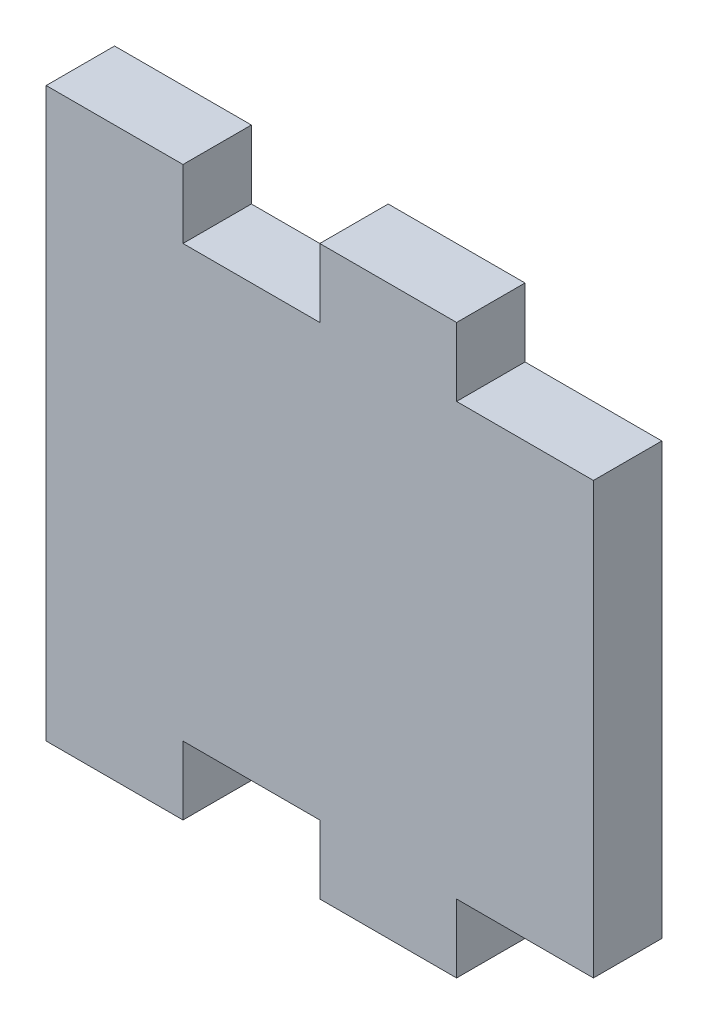
ISO-10303-21;
HEADER;
FILE_DESCRIPTION(('STEP AP214'),'2;1');
FILE_NAME('part.step','',(''),(''),'','','');
FILE_SCHEMA(('AUTOMOTIVE_DESIGN { 1 0 10303 214 1 1 1 1 }'));
ENDSEC;
DATA;
#1=APPLICATION_CONTEXT('core data for automotive mechanical design processes');
#2=APPLICATION_PROTOCOL_DEFINITION('international standard','automotive_design',2000,#1);
#3=PRODUCT_CONTEXT('',#1,'mechanical');
#4=PRODUCT('Part','Part','',(#3));
#5=PRODUCT_RELATED_PRODUCT_CATEGORY('part','',(#4));
#6=PRODUCT_DEFINITION_FORMATION('','',#4);
#7=PRODUCT_DEFINITION_CONTEXT('part definition',#1,'design');
#8=PRODUCT_DEFINITION('design','',#6,#7);
#9=PRODUCT_DEFINITION_SHAPE('','',#8);
#10=(LENGTH_UNIT() NAMED_UNIT(*) SI_UNIT(.MILLI.,.METRE.));
#11=(NAMED_UNIT(*) PLANE_ANGLE_UNIT() SI_UNIT($,.RADIAN.));
#12=(NAMED_UNIT(*) SI_UNIT($,.STERADIAN.) SOLID_ANGLE_UNIT());
#13=UNCERTAINTY_MEASURE_WITH_UNIT(LENGTH_MEASURE(1.E-05),#10,'distance_accuracy_value','');
#14=(GEOMETRIC_REPRESENTATION_CONTEXT(3) GLOBAL_UNCERTAINTY_ASSIGNED_CONTEXT((#13)) GLOBAL_UNIT_ASSIGNED_CONTEXT((#10,
#11,#12)) REPRESENTATION_CONTEXT('',''));
#15=CARTESIAN_POINT('',(0.,0.,0.));
#16=DIRECTION('',(0.,0.,1.));
#17=DIRECTION('',(1.,0.,0.));
#18=AXIS2_PLACEMENT_3D('',#15,#16,#17);
#19=CARTESIAN_POINT('',(0.,-3.175,3.175));
#20=DIRECTION('',(0.,1.,0.));
#21=DIRECTION('',(0.,0.,1.));
#22=AXIS2_PLACEMENT_3D('',#19,#20,#21);
#23=PLANE('',#22);
#24=DIRECTION('',(1.,0.,0.));
#25=VECTOR('',#24,1.);
#26=CARTESIAN_POINT('',(0.,-3.175,0.));
#27=LINE('',#26,#25);
#28=CARTESIAN_POINT('',(0.,-3.175,0.));
#29=VERTEX_POINT('',#28);
#30=CARTESIAN_POINT('',(6.35,-3.175,0.));
#31=VERTEX_POINT('',#30);
#32=EDGE_CURVE('E177',#29,#31,#27,.T.);
#33=ORIENTED_EDGE('',*,*,#32,.T.);
#34=DIRECTION('',(0.,0.,-1.));
#35=VECTOR('',#34,1.);
#36=CARTESIAN_POINT('',(6.35,-3.175,3.175));
#37=LINE('',#36,#35);
#38=CARTESIAN_POINT('',(6.35,-3.175,3.175));
#39=VERTEX_POINT('',#38);
#40=EDGE_CURVE('E41',#39,#31,#37,.T.);
#41=ORIENTED_EDGE('',*,*,#40,.F.);
#42=DIRECTION('',(1.,0.,0.));
#43=VECTOR('',#42,1.);
#44=CARTESIAN_POINT('',(0.,-3.175,3.175));
#45=LINE('',#44,#43);
#46=CARTESIAN_POINT('',(0.,-3.175,3.175));
#47=VERTEX_POINT('',#46);
#48=EDGE_CURVE('E294',#47,#39,#45,.T.);
#49=ORIENTED_EDGE('',*,*,#48,.F.);
#50=DIRECTION('',(0.,0.,-1.));
#51=VECTOR('',#50,1.);
#52=CARTESIAN_POINT('',(0.,-3.175,3.175));
#53=LINE('',#52,#51);
#54=EDGE_CURVE('E11',#47,#29,#53,.T.);
#55=ORIENTED_EDGE('',*,*,#54,.T.);
#56=EDGE_LOOP('',(#33,#41,#49,#55));
#57=FACE_BOUND('',#56,.T.);
#58=ADVANCED_FACE('F33',(#57),#23,.F.);
#59=CARTESIAN_POINT('',(6.35,-3.175,3.175));
#60=DIRECTION('',(-1.,0.,0.));
#61=DIRECTION('',(0.,0.,1.));
#62=AXIS2_PLACEMENT_3D('',#59,#60,#61);
#63=PLANE('',#62);
#64=DIRECTION('',(0.,1.,0.));
#65=VECTOR('',#64,1.);
#66=CARTESIAN_POINT('',(6.35,-3.175,0.));
#67=LINE('',#66,#65);
#68=CARTESIAN_POINT('',(6.35,0.,0.));
#69=VERTEX_POINT('',#68);
#70=EDGE_CURVE('E179',#31,#69,#67,.T.);
#71=ORIENTED_EDGE('',*,*,#70,.T.);
#72=DIRECTION('',(0.,0.,-1.));
#73=VECTOR('',#72,1.);
#74=CARTESIAN_POINT('',(6.35,0.,3.175));
#75=LINE('',#74,#73);
#76=CARTESIAN_POINT('',(6.35,0.,3.175));
#77=VERTEX_POINT('',#76);
#78=EDGE_CURVE('E236',#77,#69,#75,.T.);
#79=ORIENTED_EDGE('',*,*,#78,.F.);
#80=DIRECTION('',(0.,1.,0.));
#81=VECTOR('',#80,1.);
#82=CARTESIAN_POINT('',(6.35,-3.175,3.175));
#83=LINE('',#82,#81);
#84=EDGE_CURVE('E245',#39,#77,#83,.T.);
#85=ORIENTED_EDGE('',*,*,#84,.F.);
#86=ORIENTED_EDGE('',*,*,#40,.T.);
#87=EDGE_LOOP('',(#71,#79,#85,#86));
#88=FACE_BOUND('',#87,.T.);
#89=ADVANCED_FACE('F243',(#88),#63,.F.);
#90=CARTESIAN_POINT('',(6.35,0.,3.175));
#91=DIRECTION('',(0.,1.,0.));
#92=DIRECTION('',(0.,0.,1.));
#93=AXIS2_PLACEMENT_3D('',#90,#91,#92);
#94=PLANE('',#93);
#95=DIRECTION('',(1.,0.,0.));
#96=VECTOR('',#95,1.);
#97=CARTESIAN_POINT('',(6.35,0.,0.));
#98=LINE('',#97,#96);
#99=CARTESIAN_POINT('',(12.7,0.,0.));
#100=VERTEX_POINT('',#99);
#101=EDGE_CURVE('E181',#69,#100,#98,.T.);
#102=ORIENTED_EDGE('',*,*,#101,.T.);
#103=DIRECTION('',(0.,0.,-1.));
#104=VECTOR('',#103,1.);
#105=CARTESIAN_POINT('',(12.7,0.,3.175));
#106=LINE('',#105,#104);
#107=CARTESIAN_POINT('',(12.7,0.,3.175));
#108=VERTEX_POINT('',#107);
#109=EDGE_CURVE('E233',#108,#100,#106,.T.);
#110=ORIENTED_EDGE('',*,*,#109,.F.);
#111=DIRECTION('',(1.,0.,0.));
#112=VECTOR('',#111,1.);
#113=CARTESIAN_POINT('',(6.35,0.,3.175));
#114=LINE('',#113,#112);
#115=EDGE_CURVE('E266',#77,#108,#114,.T.);
#116=ORIENTED_EDGE('',*,*,#115,.F.);
#117=ORIENTED_EDGE('',*,*,#78,.T.);
#118=EDGE_LOOP('',(#102,#110,#116,#117));
#119=FACE_BOUND('',#118,.T.);
#120=ADVANCED_FACE('F257',(#119),#94,.F.);
#121=CARTESIAN_POINT('',(12.7,0.,3.175));
#122=DIRECTION('',(1.,0.,0.));
#123=DIRECTION('',(0.,0.,-1.));
#124=AXIS2_PLACEMENT_3D('',#121,#122,#123);
#125=PLANE('',#124);
#126=DIRECTION('',(0.,-1.,0.));
#127=VECTOR('',#126,1.);
#128=CARTESIAN_POINT('',(12.7,0.,0.));
#129=LINE('',#128,#127);
#130=CARTESIAN_POINT('',(12.7,-3.175,0.));
#131=VERTEX_POINT('',#130);
#132=EDGE_CURVE('E183',#100,#131,#129,.T.);
#133=ORIENTED_EDGE('',*,*,#132,.T.);
#134=DIRECTION('',(0.,0.,-1.));
#135=VECTOR('',#134,1.);
#136=CARTESIAN_POINT('',(12.7,-3.175,3.175));
#137=LINE('',#136,#135);
#138=CARTESIAN_POINT('',(12.7,-3.175,3.175));
#139=VERTEX_POINT('',#138);
#140=EDGE_CURVE('E230',#139,#131,#137,.T.);
#141=ORIENTED_EDGE('',*,*,#140,.F.);
#142=DIRECTION('',(0.,-1.,0.));
#143=VECTOR('',#142,1.);
#144=CARTESIAN_POINT('',(12.7,0.,3.175));
#145=LINE('',#144,#143);
#146=EDGE_CURVE('E263',#108,#139,#145,.T.);
#147=ORIENTED_EDGE('',*,*,#146,.F.);
#148=ORIENTED_EDGE('',*,*,#109,.T.);
#149=EDGE_LOOP('',(#133,#141,#147,#148));
#150=FACE_BOUND('',#149,.T.);
#151=ADVANCED_FACE('F261',(#150),#125,.F.);
#152=CARTESIAN_POINT('',(12.7,-3.175,3.175));
#153=DIRECTION('',(0.,1.,0.));
#154=DIRECTION('',(-1.,0.,0.));
#155=AXIS2_PLACEMENT_3D('',#152,#153,#154);
#156=PLANE('',#155);
#157=DIRECTION('',(1.,0.,0.));
#158=VECTOR('',#157,1.);
#159=CARTESIAN_POINT('',(12.7,-3.175,0.));
#160=LINE('',#159,#158);
#161=CARTESIAN_POINT('',(19.05,-3.175,0.));
#162=VERTEX_POINT('',#161);
#163=EDGE_CURVE('E185',#131,#162,#160,.T.);
#164=ORIENTED_EDGE('',*,*,#163,.T.);
#165=DIRECTION('',(0.,0.,-1.));
#166=VECTOR('',#165,1.);
#167=CARTESIAN_POINT('',(19.05,-3.175,3.175));
#168=LINE('',#167,#166);
#169=CARTESIAN_POINT('',(19.05,-3.175,3.175));
#170=VERTEX_POINT('',#169);
#171=EDGE_CURVE('E227',#170,#162,#168,.T.);
#172=ORIENTED_EDGE('',*,*,#171,.F.);
#173=DIRECTION('',(1.,0.,0.));
#174=VECTOR('',#173,1.);
#175=CARTESIAN_POINT('',(12.7,-3.175,3.175));
#176=LINE('',#175,#174);
#177=EDGE_CURVE('E265',#139,#170,#176,.T.);
#178=ORIENTED_EDGE('',*,*,#177,.F.);
#179=ORIENTED_EDGE('',*,*,#140,.T.);
#180=EDGE_LOOP('',(#164,#172,#178,#179));
#181=FACE_BOUND('',#180,.T.);
#182=ADVANCED_FACE('F308',(#181),#156,.F.);
#183=CARTESIAN_POINT('',(19.05,-3.175,3.175));
#184=DIRECTION('',(-1.,0.,0.));
#185=DIRECTION('',(0.,0.,1.));
#186=AXIS2_PLACEMENT_3D('',#183,#184,#185);
#187=PLANE('',#186);
#188=DIRECTION('',(0.,1.,0.));
#189=VECTOR('',#188,1.);
#190=CARTESIAN_POINT('',(19.05,-3.175,0.));
#191=LINE('',#190,#189);
#192=CARTESIAN_POINT('',(19.05,0.,0.));
#193=VERTEX_POINT('',#192);
#194=EDGE_CURVE('E187',#162,#193,#191,.T.);
#195=ORIENTED_EDGE('',*,*,#194,.T.);
#196=DIRECTION('',(0.,0.,-1.));
#197=VECTOR('',#196,1.);
#198=CARTESIAN_POINT('',(19.05,0.,3.175));
#199=LINE('',#198,#197);
#200=CARTESIAN_POINT('',(19.05,0.,3.175));
#201=VERTEX_POINT('',#200);
#202=EDGE_CURVE('E224',#201,#193,#199,.T.);
#203=ORIENTED_EDGE('',*,*,#202,.F.);
#204=DIRECTION('',(0.,1.,0.));
#205=VECTOR('',#204,1.);
#206=CARTESIAN_POINT('',(19.05,-3.175,3.175));
#207=LINE('',#206,#205);
#208=EDGE_CURVE('E268',#170,#201,#207,.T.);
#209=ORIENTED_EDGE('',*,*,#208,.F.);
#210=ORIENTED_EDGE('',*,*,#171,.T.);
#211=EDGE_LOOP('',(#195,#203,#209,#210));
#212=FACE_BOUND('',#211,.T.);
#213=ADVANCED_FACE('F311',(#212),#187,.F.);
#214=CARTESIAN_POINT('',(19.05,0.,3.175));
#215=DIRECTION('',(0.,1.,0.));
#216=DIRECTION('',(0.,0.,1.));
#217=AXIS2_PLACEMENT_3D('',#214,#215,#216);
#218=PLANE('',#217);
#219=DIRECTION('',(1.,0.,0.));
#220=VECTOR('',#219,1.);
#221=CARTESIAN_POINT('',(19.05,0.,0.));
#222=LINE('',#221,#220);
#223=CARTESIAN_POINT('',(25.4,0.,0.));
#224=VERTEX_POINT('',#223);
#225=EDGE_CURVE('E189',#193,#224,#222,.T.);
#226=ORIENTED_EDGE('',*,*,#225,.T.);
#227=DIRECTION('',(0.,0.,-1.));
#228=VECTOR('',#227,1.);
#229=CARTESIAN_POINT('',(25.4,0.,3.175));
#230=LINE('',#229,#228);
#231=CARTESIAN_POINT('',(25.4,0.,3.175));
#232=VERTEX_POINT('',#231);
#233=EDGE_CURVE('E221',#232,#224,#230,.T.);
#234=ORIENTED_EDGE('',*,*,#233,.F.);
#235=DIRECTION('',(1.,0.,0.));
#236=VECTOR('',#235,1.);
#237=CARTESIAN_POINT('',(19.05,0.,3.175));
#238=LINE('',#237,#236);
#239=EDGE_CURVE('E274',#201,#232,#238,.T.);
#240=ORIENTED_EDGE('',*,*,#239,.F.);
#241=ORIENTED_EDGE('',*,*,#202,.T.);
#242=EDGE_LOOP('',(#226,#234,#240,#241));
#243=FACE_BOUND('',#242,.T.);
#244=ADVANCED_FACE('F315',(#243),#218,.F.);
#245=CARTESIAN_POINT('',(25.4,0.,3.175));
#246=DIRECTION('',(-1.,0.,0.));
#247=DIRECTION('',(0.,0.,1.));
#248=AXIS2_PLACEMENT_3D('',#245,#246,#247);
#249=PLANE('',#248);
#250=DIRECTION('',(0.,1.,0.));
#251=VECTOR('',#250,1.);
#252=CARTESIAN_POINT('',(25.4,0.,0.));
#253=LINE('',#252,#251);
#254=CARTESIAN_POINT('',(25.4,20.,0.));
#255=VERTEX_POINT('',#254);
#256=EDGE_CURVE('E191',#224,#255,#253,.T.);
#257=ORIENTED_EDGE('',*,*,#256,.T.);
#258=DIRECTION('',(0.,0.,-1.));
#259=VECTOR('',#258,1.);
#260=CARTESIAN_POINT('',(25.4,20.,3.175));
#261=LINE('',#260,#259);
#262=CARTESIAN_POINT('',(25.4,20.,3.175));
#263=VERTEX_POINT('',#262);
#264=EDGE_CURVE('E218',#263,#255,#261,.T.);
#265=ORIENTED_EDGE('',*,*,#264,.F.);
#266=DIRECTION('',(0.,1.,0.));
#267=VECTOR('',#266,1.);
#268=CARTESIAN_POINT('',(25.4,0.,3.175));
#269=LINE('',#268,#267);
#270=EDGE_CURVE('E276',#232,#263,#269,.T.);
#271=ORIENTED_EDGE('',*,*,#270,.F.);
#272=ORIENTED_EDGE('',*,*,#233,.T.);
#273=EDGE_LOOP('',(#257,#265,#271,#272));
#274=FACE_BOUND('',#273,.T.);
#275=ADVANCED_FACE('F319',(#274),#249,.F.);
#276=CARTESIAN_POINT('',(19.05,20.,3.175));
#277=DIRECTION('',(0.,-1.,0.));
#278=DIRECTION('',(0.,0.,-1.));
#279=AXIS2_PLACEMENT_3D('',#276,#277,#278);
#280=PLANE('',#279);
#281=DIRECTION('',(-1.,0.,0.));
#282=VECTOR('',#281,1.);
#283=CARTESIAN_POINT('',(19.05,20.,0.));
#284=LINE('',#283,#282);
#285=CARTESIAN_POINT('',(19.05,20.,0.));
#286=VERTEX_POINT('',#285);
#287=EDGE_CURVE('E193',#255,#286,#284,.T.);
#288=ORIENTED_EDGE('',*,*,#287,.T.);
#289=DIRECTION('',(0.,0.,-1.));
#290=VECTOR('',#289,1.);
#291=CARTESIAN_POINT('',(19.05,20.,3.175));
#292=LINE('',#291,#290);
#293=CARTESIAN_POINT('',(19.05,20.,3.175));
#294=VERTEX_POINT('',#293);
#295=EDGE_CURVE('E215',#294,#286,#292,.T.);
#296=ORIENTED_EDGE('',*,*,#295,.F.);
#297=DIRECTION('',(-1.,0.,0.));
#298=VECTOR('',#297,1.);
#299=CARTESIAN_POINT('',(19.05,20.,3.175));
#300=LINE('',#299,#298);
#301=EDGE_CURVE('E278',#263,#294,#300,.T.);
#302=ORIENTED_EDGE('',*,*,#301,.F.);
#303=ORIENTED_EDGE('',*,*,#264,.T.);
#304=EDGE_LOOP('',(#288,#296,#302,#303));
#305=FACE_BOUND('',#304,.T.);
#306=ADVANCED_FACE('F323',(#305),#280,.F.);
#307=CARTESIAN_POINT('',(19.05,23.175,3.175));
#308=DIRECTION('',(-1.,0.,0.));
#309=DIRECTION('',(0.,0.,1.));
#310=AXIS2_PLACEMENT_3D('',#307,#308,#309);
#311=PLANE('',#310);
#312=DIRECTION('',(0.,1.,0.));
#313=VECTOR('',#312,1.);
#314=CARTESIAN_POINT('',(19.05,23.175,0.));
#315=LINE('',#314,#313);
#316=CARTESIAN_POINT('',(19.05,23.175,0.));
#317=VERTEX_POINT('',#316);
#318=EDGE_CURVE('E195',#286,#317,#315,.T.);
#319=ORIENTED_EDGE('',*,*,#318,.T.);
#320=DIRECTION('',(0.,0.,-1.));
#321=VECTOR('',#320,1.);
#322=CARTESIAN_POINT('',(19.05,23.175,3.175));
#323=LINE('',#322,#321);
#324=CARTESIAN_POINT('',(19.05,23.175,3.175));
#325=VERTEX_POINT('',#324);
#326=EDGE_CURVE('E212',#325,#317,#323,.T.);
#327=ORIENTED_EDGE('',*,*,#326,.F.);
#328=DIRECTION('',(0.,1.,0.));
#329=VECTOR('',#328,1.);
#330=CARTESIAN_POINT('',(19.05,23.175,3.175));
#331=LINE('',#330,#329);
#332=EDGE_CURVE('E280',#294,#325,#331,.T.);
#333=ORIENTED_EDGE('',*,*,#332,.F.);
#334=ORIENTED_EDGE('',*,*,#295,.T.);
#335=EDGE_LOOP('',(#319,#327,#333,#334));
#336=FACE_BOUND('',#335,.T.);
#337=ADVANCED_FACE('F327',(#336),#311,.F.);
#338=CARTESIAN_POINT('',(12.7,23.175,3.175));
#339=DIRECTION('',(0.,-1.,0.));
#340=DIRECTION('',(1.,0.,0.));
#341=AXIS2_PLACEMENT_3D('',#338,#339,#340);
#342=PLANE('',#341);
#343=DIRECTION('',(-1.,0.,0.));
#344=VECTOR('',#343,1.);
#345=CARTESIAN_POINT('',(12.7,23.175,0.));
#346=LINE('',#345,#344);
#347=CARTESIAN_POINT('',(12.7,23.175,0.));
#348=VERTEX_POINT('',#347);
#349=EDGE_CURVE('E197',#317,#348,#346,.T.);
#350=ORIENTED_EDGE('',*,*,#349,.T.);
#351=DIRECTION('',(0.,0.,-1.));
#352=VECTOR('',#351,1.);
#353=CARTESIAN_POINT('',(12.7,23.175,3.175));
#354=LINE('',#353,#352);
#355=CARTESIAN_POINT('',(12.7,23.175,3.175));
#356=VERTEX_POINT('',#355);
#357=EDGE_CURVE('E209',#356,#348,#354,.T.);
#358=ORIENTED_EDGE('',*,*,#357,.F.);
#359=DIRECTION('',(-1.,0.,0.));
#360=VECTOR('',#359,1.);
#361=CARTESIAN_POINT('',(12.7,23.175,3.175));
#362=LINE('',#361,#360);
#363=EDGE_CURVE('E282',#325,#356,#362,.T.);
#364=ORIENTED_EDGE('',*,*,#363,.F.);
#365=ORIENTED_EDGE('',*,*,#326,.T.);
#366=EDGE_LOOP('',(#350,#358,#364,#365));
#367=FACE_BOUND('',#366,.T.);
#368=ADVANCED_FACE('F288',(#367),#342,.F.);
#369=CARTESIAN_POINT('',(12.7,20.,3.175));
#370=DIRECTION('',(1.,0.,0.));
#371=DIRECTION('',(0.,0.,-1.));
#372=AXIS2_PLACEMENT_3D('',#369,#370,#371);
#373=PLANE('',#372);
#374=DIRECTION('',(0.,-1.,0.));
#375=VECTOR('',#374,1.);
#376=CARTESIAN_POINT('',(12.7,20.,0.));
#377=LINE('',#376,#375);
#378=CARTESIAN_POINT('',(12.7,20.,0.));
#379=VERTEX_POINT('',#378);
#380=EDGE_CURVE('E199',#348,#379,#377,.T.);
#381=ORIENTED_EDGE('',*,*,#380,.T.);
#382=DIRECTION('',(0.,0.,-1.));
#383=VECTOR('',#382,1.);
#384=CARTESIAN_POINT('',(12.7,20.,3.175));
#385=LINE('',#384,#383);
#386=CARTESIAN_POINT('',(12.7,20.,3.175));
#387=VERTEX_POINT('',#386);
#388=EDGE_CURVE('E166',#387,#379,#385,.T.);
#389=ORIENTED_EDGE('',*,*,#388,.F.);
#390=DIRECTION('',(0.,-1.,0.));
#391=VECTOR('',#390,1.);
#392=CARTESIAN_POINT('',(12.7,20.,3.175));
#393=LINE('',#392,#391);
#394=EDGE_CURVE('E157',#356,#387,#393,.T.);
#395=ORIENTED_EDGE('',*,*,#394,.F.);
#396=ORIENTED_EDGE('',*,*,#357,.T.);
#397=EDGE_LOOP('',(#381,#389,#395,#396));
#398=FACE_BOUND('',#397,.T.);
#399=ADVANCED_FACE('F292',(#398),#373,.F.);
#400=CARTESIAN_POINT('',(6.35,20.,3.175));
#401=DIRECTION('',(0.,-1.,0.));
#402=DIRECTION('',(0.,0.,-1.));
#403=AXIS2_PLACEMENT_3D('',#400,#401,#402);
#404=PLANE('',#403);
#405=DIRECTION('',(-1.,0.,0.));
#406=VECTOR('',#405,1.);
#407=CARTESIAN_POINT('',(6.35,20.,0.));
#408=LINE('',#407,#406);
#409=CARTESIAN_POINT('',(6.35,20.,0.));
#410=VERTEX_POINT('',#409);
#411=EDGE_CURVE('E165',#379,#410,#408,.T.);
#412=ORIENTED_EDGE('',*,*,#411,.T.);
#413=DIRECTION('',(0.,0.,-1.));
#414=VECTOR('',#413,1.);
#415=CARTESIAN_POINT('',(6.35,20.,3.175));
#416=LINE('',#415,#414);
#417=CARTESIAN_POINT('',(6.35,20.,3.175));
#418=VERTEX_POINT('',#417);
#419=EDGE_CURVE('E162',#418,#410,#416,.T.);
#420=ORIENTED_EDGE('',*,*,#419,.F.);
#421=DIRECTION('',(-1.,0.,0.));
#422=VECTOR('',#421,1.);
#423=CARTESIAN_POINT('',(6.35,20.,3.175));
#424=LINE('',#423,#422);
#425=EDGE_CURVE('E151',#387,#418,#424,.T.);
#426=ORIENTED_EDGE('',*,*,#425,.F.);
#427=ORIENTED_EDGE('',*,*,#388,.T.);
#428=EDGE_LOOP('',(#412,#420,#426,#427));
#429=FACE_BOUND('',#428,.T.);
#430=ADVANCED_FACE('F163',(#429),#404,.F.);
#431=CARTESIAN_POINT('',(6.35,23.175,3.175));
#432=DIRECTION('',(-1.,0.,0.));
#433=DIRECTION('',(0.,0.,1.));
#434=AXIS2_PLACEMENT_3D('',#431,#432,#433);
#435=PLANE('',#434);
#436=DIRECTION('',(0.,1.,0.));
#437=VECTOR('',#436,1.);
#438=CARTESIAN_POINT('',(6.35,23.175,0.));
#439=LINE('',#438,#437);
#440=CARTESIAN_POINT('',(6.35,23.175,0.));
#441=VERTEX_POINT('',#440);
#442=EDGE_CURVE('E103',#410,#441,#439,.T.);
#443=ORIENTED_EDGE('',*,*,#442,.T.);
#444=DIRECTION('',(0.,0.,-1.));
#445=VECTOR('',#444,1.);
#446=CARTESIAN_POINT('',(6.35,23.175,3.175));
#447=LINE('',#446,#445);
#448=CARTESIAN_POINT('',(6.35,23.175,3.175));
#449=VERTEX_POINT('',#448);
#450=EDGE_CURVE('E167',#449,#441,#447,.T.);
#451=ORIENTED_EDGE('',*,*,#450,.F.);
#452=DIRECTION('',(0.,1.,0.));
#453=VECTOR('',#452,1.);
#454=CARTESIAN_POINT('',(6.35,23.175,3.175));
#455=LINE('',#454,#453);
#456=EDGE_CURVE('E155',#418,#449,#455,.T.);
#457=ORIENTED_EDGE('',*,*,#456,.F.);
#458=ORIENTED_EDGE('',*,*,#419,.T.);
#459=EDGE_LOOP('',(#443,#451,#457,#458));
#460=FACE_BOUND('',#459,.T.);
#461=ADVANCED_FACE('F169',(#460),#435,.F.);
#462=CARTESIAN_POINT('',(0.,23.175,3.175));
#463=DIRECTION('',(0.,-1.,0.));
#464=DIRECTION('',(0.,0.,-1.));
#465=AXIS2_PLACEMENT_3D('',#462,#463,#464);
#466=PLANE('',#465);
#467=DIRECTION('',(-1.,0.,0.));
#468=VECTOR('',#467,1.);
#469=CARTESIAN_POINT('',(0.,23.175,0.));
#470=LINE('',#469,#468);
#471=CARTESIAN_POINT('',(0.,23.175,0.));
#472=VERTEX_POINT('',#471);
#473=EDGE_CURVE('E110',#441,#472,#470,.T.);
#474=ORIENTED_EDGE('',*,*,#473,.T.);
#475=DIRECTION('',(0.,0.,-1.));
#476=VECTOR('',#475,1.);
#477=CARTESIAN_POINT('',(0.,23.175,3.175));
#478=LINE('',#477,#476);
#479=CARTESIAN_POINT('',(0.,23.175,3.175));
#480=VERTEX_POINT('',#479);
#481=EDGE_CURVE('E173',#480,#472,#478,.T.);
#482=ORIENTED_EDGE('',*,*,#481,.F.);
#483=DIRECTION('',(-1.,0.,0.));
#484=VECTOR('',#483,1.);
#485=CARTESIAN_POINT('',(0.,23.175,3.175));
#486=LINE('',#485,#484);
#487=EDGE_CURVE('E171',#449,#480,#486,.T.);
#488=ORIENTED_EDGE('',*,*,#487,.F.);
#489=ORIENTED_EDGE('',*,*,#450,.T.);
#490=EDGE_LOOP('',(#474,#482,#488,#489));
#491=FACE_BOUND('',#490,.T.);
#492=ADVANCED_FACE('F340',(#491),#466,.F.);
#493=CARTESIAN_POINT('',(0.,20.,3.175));
#494=DIRECTION('',(1.,0.,0.));
#495=DIRECTION('',(0.,1.,0.));
#496=AXIS2_PLACEMENT_3D('',#493,#494,#495);
#497=PLANE('',#496);
#498=DIRECTION('',(0.,-1.,0.));
#499=VECTOR('',#498,1.);
#500=CARTESIAN_POINT('',(0.,20.,0.));
#501=LINE('',#500,#499);
#502=EDGE_CURVE('E204',#472,#29,#501,.T.);
#503=ORIENTED_EDGE('',*,*,#502,.T.);
#504=ORIENTED_EDGE('',*,*,#54,.F.);
#505=DIRECTION('',(0.,-1.,0.));
#506=VECTOR('',#505,1.);
#507=CARTESIAN_POINT('',(0.,0.,3.175));
#508=LINE('',#507,#506);
#509=EDGE_CURVE('E49',#480,#47,#508,.T.);
#510=ORIENTED_EDGE('',*,*,#509,.F.);
#511=ORIENTED_EDGE('',*,*,#481,.T.);
#512=EDGE_LOOP('',(#503,#504,#510,#511));
#513=FACE_BOUND('',#512,.T.);
#514=ADVANCED_FACE('F293',(#513),#497,.F.);
#515=CARTESIAN_POINT('',(0.,23.175,3.175));
#516=DIRECTION('',(0.,0.,-1.));
#517=DIRECTION('',(-1.,0.,0.));
#518=AXIS2_PLACEMENT_3D('',#515,#516,#517);
#519=PLANE('',#518);
#520=ORIENTED_EDGE('',*,*,#509,.T.);
#521=ORIENTED_EDGE('',*,*,#48,.T.);
#522=ORIENTED_EDGE('',*,*,#84,.T.);
#523=ORIENTED_EDGE('',*,*,#115,.T.);
#524=ORIENTED_EDGE('',*,*,#146,.T.);
#525=ORIENTED_EDGE('',*,*,#177,.T.);
#526=ORIENTED_EDGE('',*,*,#208,.T.);
#527=ORIENTED_EDGE('',*,*,#239,.T.);
#528=ORIENTED_EDGE('',*,*,#270,.T.);
#529=ORIENTED_EDGE('',*,*,#301,.T.);
#530=ORIENTED_EDGE('',*,*,#332,.T.);
#531=ORIENTED_EDGE('',*,*,#363,.T.);
#532=ORIENTED_EDGE('',*,*,#394,.T.);
#533=ORIENTED_EDGE('',*,*,#425,.T.);
#534=ORIENTED_EDGE('',*,*,#456,.T.);
#535=ORIENTED_EDGE('',*,*,#487,.T.);
#536=EDGE_LOOP('',(#520,#521,#522,#523,#524,#525,#526,#527,#528,#529,#530,#531,#532,#533,#534,#535));
#537=FACE_BOUND('',#536,.T.);
#538=ADVANCED_FACE('F153',(#537),#519,.F.);
#539=CARTESIAN_POINT('',(0.,23.175,0.));
#540=DIRECTION('',(0.,0.,-1.));
#541=DIRECTION('',(-1.,0.,0.));
#542=AXIS2_PLACEMENT_3D('',#539,#540,#541);
#543=PLANE('',#542);
#544=ORIENTED_EDGE('',*,*,#32,.F.);
#545=ORIENTED_EDGE('',*,*,#502,.F.);
#546=ORIENTED_EDGE('',*,*,#473,.F.);
#547=ORIENTED_EDGE('',*,*,#442,.F.);
#548=ORIENTED_EDGE('',*,*,#411,.F.);
#549=ORIENTED_EDGE('',*,*,#380,.F.);
#550=ORIENTED_EDGE('',*,*,#349,.F.);
#551=ORIENTED_EDGE('',*,*,#318,.F.);
#552=ORIENTED_EDGE('',*,*,#287,.F.);
#553=ORIENTED_EDGE('',*,*,#256,.F.);
#554=ORIENTED_EDGE('',*,*,#225,.F.);
#555=ORIENTED_EDGE('',*,*,#194,.F.);
#556=ORIENTED_EDGE('',*,*,#163,.F.);
#557=ORIENTED_EDGE('',*,*,#132,.F.);
#558=ORIENTED_EDGE('',*,*,#101,.F.);
#559=ORIENTED_EDGE('',*,*,#70,.F.);
#560=EDGE_LOOP('',(#544,#545,#546,#547,#548,#549,#550,#551,#552,#553,#554,#555,#556,#557,#558,#559));
#561=FACE_BOUND('',#560,.T.);
#562=ADVANCED_FACE('F251',(#561),#543,.T.);
#563=CLOSED_SHELL('',(#58,#89,#120,#151,#182,#213,#244,#275,#306,#337,#368,#399,#430,#461,#492,
#514,#538,#562));
#564=MANIFOLD_SOLID_BREP('B2',#563);
#565=ADVANCED_BREP_SHAPE_REPRESENTATION('',(#18,#564),#14);
#566=SHAPE_DEFINITION_REPRESENTATION(#9,#565);
ENDSEC;
END-ISO-10303-21;
